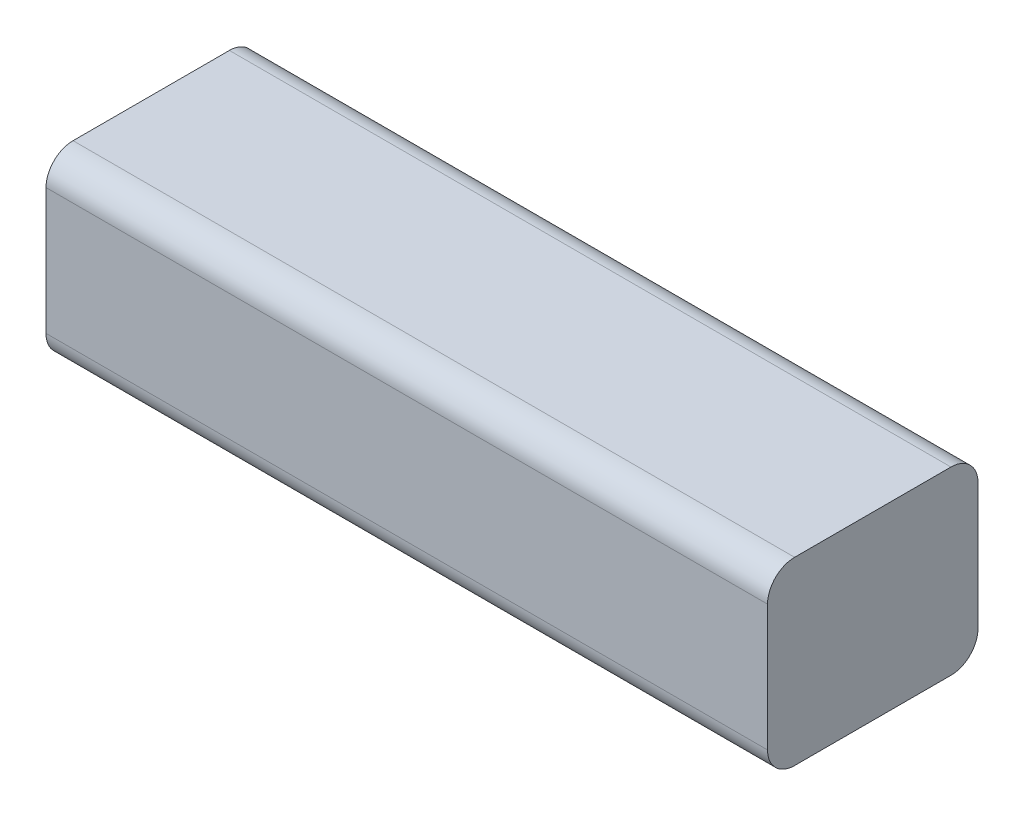
ISO-10303-21;
HEADER;
FILE_DESCRIPTION(('STEP AP214'),'2;1');
FILE_NAME('part.step','',(''),(''),'','','');
FILE_SCHEMA(('AUTOMOTIVE_DESIGN { 1 0 10303 214 1 1 1 1 }'));
ENDSEC;
DATA;
#1=APPLICATION_CONTEXT('core data for automotive mechanical design processes');
#2=APPLICATION_PROTOCOL_DEFINITION('international standard','automotive_design',2000,#1);
#3=PRODUCT_CONTEXT('',#1,'mechanical');
#4=PRODUCT('Part','Part','',(#3));
#5=PRODUCT_RELATED_PRODUCT_CATEGORY('part','',(#4));
#6=PRODUCT_DEFINITION_FORMATION('','',#4);
#7=PRODUCT_DEFINITION_CONTEXT('part definition',#1,'design');
#8=PRODUCT_DEFINITION('design','',#6,#7);
#9=PRODUCT_DEFINITION_SHAPE('','',#8);
#10=(LENGTH_UNIT() NAMED_UNIT(*) SI_UNIT(.MILLI.,.METRE.));
#11=(NAMED_UNIT(*) PLANE_ANGLE_UNIT() SI_UNIT($,.RADIAN.));
#12=(NAMED_UNIT(*) SI_UNIT($,.STERADIAN.) SOLID_ANGLE_UNIT());
#13=UNCERTAINTY_MEASURE_WITH_UNIT(LENGTH_MEASURE(1.E-05),#10,'distance_accuracy_value','');
#14=(GEOMETRIC_REPRESENTATION_CONTEXT(3) GLOBAL_UNCERTAINTY_ASSIGNED_CONTEXT((#13)) GLOBAL_UNIT_ASSIGNED_CONTEXT((#10,
#11,#12)) REPRESENTATION_CONTEXT('',''));
#15=CARTESIAN_POINT('',(0.,0.,0.));
#16=DIRECTION('',(0.,0.,1.));
#17=DIRECTION('',(1.,0.,0.));
#18=AXIS2_PLACEMENT_3D('',#15,#16,#17);
#19=CARTESIAN_POINT('',(120.,0.,35.));
#20=DIRECTION('',(0.,1.,0.));
#21=DIRECTION('',(-1.,0.,0.));
#22=AXIS2_PLACEMENT_3D('',#19,#20,#21);
#23=PLANE('',#22);
#24=DIRECTION('',(0.,0.,-1.));
#25=VECTOR('',#24,1.);
#26=CARTESIAN_POINT('',(120.,0.,35.));
#27=LINE('',#26,#25);
#28=CARTESIAN_POINT('',(120.,0.,30.5));
#29=VERTEX_POINT('',#28);
#30=CARTESIAN_POINT('',(120.,0.,4.5));
#31=VERTEX_POINT('',#30);
#32=EDGE_CURVE('E149',#29,#31,#27,.T.);
#33=ORIENTED_EDGE('',*,*,#32,.F.);
#34=DIRECTION('',(1.,0.,0.));
#35=VECTOR('',#34,1.);
#36=CARTESIAN_POINT('',(120.,0.,30.5));
#37=LINE('',#36,#35);
#38=CARTESIAN_POINT('',(0.,0.,30.5));
#39=VERTEX_POINT('',#38);
#40=EDGE_CURVE('E110',#29,#39,#37,.F.);
#41=ORIENTED_EDGE('',*,*,#40,.T.);
#42=DIRECTION('',(0.,0.,-1.));
#43=VECTOR('',#42,1.);
#44=CARTESIAN_POINT('',(0.,0.,35.));
#45=LINE('',#44,#43);
#46=CARTESIAN_POINT('',(0.,0.,4.5));
#47=VERTEX_POINT('',#46);
#48=EDGE_CURVE('E134',#39,#47,#45,.T.);
#49=ORIENTED_EDGE('',*,*,#48,.T.);
#50=DIRECTION('',(1.,0.,0.));
#51=VECTOR('',#50,1.);
#52=CARTESIAN_POINT('',(120.,0.,4.5));
#53=LINE('',#52,#51);
#54=EDGE_CURVE('E115',#47,#31,#53,.T.);
#55=ORIENTED_EDGE('',*,*,#54,.T.);
#56=EDGE_LOOP('',(#33,#41,#49,#55));
#57=FACE_BOUND('',#56,.T.);
#58=ADVANCED_FACE('F39',(#57),#23,.F.);
#59=CARTESIAN_POINT('',(120.,30.,35.));
#60=DIRECTION('',(-1.,0.,0.));
#61=DIRECTION('',(0.,0.,1.));
#62=AXIS2_PLACEMENT_3D('',#59,#60,#61);
#63=PLANE('',#62);
#64=DIRECTION('',(0.,1.,0.));
#65=VECTOR('',#64,1.);
#66=CARTESIAN_POINT('',(120.,30.,35.));
#67=LINE('',#66,#65);
#68=CARTESIAN_POINT('',(120.,4.5,35.));
#69=VERTEX_POINT('',#68);
#70=CARTESIAN_POINT('',(120.,25.5,35.));
#71=VERTEX_POINT('',#70);
#72=EDGE_CURVE('E123',#69,#71,#67,.T.);
#73=ORIENTED_EDGE('',*,*,#72,.F.);
#74=CARTESIAN_POINT('',(120.,4.5,30.5));
#75=DIRECTION('',(-1.,0.,0.));
#76=DIRECTION('',(0.,0.,1.));
#77=AXIS2_PLACEMENT_3D('',#74,#75,#76);
#78=CIRCLE('',#77,4.5);
#79=EDGE_CURVE('E105',#69,#29,#78,.F.);
#80=ORIENTED_EDGE('',*,*,#79,.T.);
#81=ORIENTED_EDGE('',*,*,#32,.T.);
#82=CARTESIAN_POINT('',(120.,4.5,4.5));
#83=DIRECTION('',(-1.,0.,0.));
#84=DIRECTION('',(0.,0.,1.));
#85=AXIS2_PLACEMENT_3D('',#82,#83,#84);
#86=CIRCLE('',#85,4.5);
#87=CARTESIAN_POINT('',(120.,4.5,0.));
#88=VERTEX_POINT('',#87);
#89=EDGE_CURVE('E116',#31,#88,#86,.F.);
#90=ORIENTED_EDGE('',*,*,#89,.T.);
#91=DIRECTION('',(0.,1.,0.));
#92=VECTOR('',#91,1.);
#93=CARTESIAN_POINT('',(120.,30.,0.));
#94=LINE('',#93,#92);
#95=CARTESIAN_POINT('',(120.,25.5,0.));
#96=VERTEX_POINT('',#95);
#97=EDGE_CURVE('E137',#88,#96,#94,.T.);
#98=ORIENTED_EDGE('',*,*,#97,.T.);
#99=CARTESIAN_POINT('',(120.,25.5,4.5));
#100=DIRECTION('',(-1.,0.,0.));
#101=DIRECTION('',(0.,0.,1.));
#102=AXIS2_PLACEMENT_3D('',#99,#100,#101);
#103=CIRCLE('',#102,4.5);
#104=CARTESIAN_POINT('',(120.,30.,4.5));
#105=VERTEX_POINT('',#104);
#106=EDGE_CURVE('E153',#96,#105,#103,.F.);
#107=ORIENTED_EDGE('',*,*,#106,.T.);
#108=DIRECTION('',(0.,0.,-1.));
#109=VECTOR('',#108,1.);
#110=CARTESIAN_POINT('',(120.,30.,35.));
#111=LINE('',#110,#109);
#112=CARTESIAN_POINT('',(120.,30.,30.5));
#113=VERTEX_POINT('',#112);
#114=EDGE_CURVE('E146',#113,#105,#111,.T.);
#115=ORIENTED_EDGE('',*,*,#114,.F.);
#116=CARTESIAN_POINT('',(120.,25.5,30.5));
#117=DIRECTION('',(-1.,0.,0.));
#118=DIRECTION('',(0.,0.,1.));
#119=AXIS2_PLACEMENT_3D('',#116,#117,#118);
#120=CIRCLE('',#119,4.5);
#121=EDGE_CURVE('E126',#113,#71,#120,.F.);
#122=ORIENTED_EDGE('',*,*,#121,.T.);
#123=EDGE_LOOP('',(#73,#80,#81,#90,#98,#107,#115,#122));
#124=FACE_BOUND('',#123,.T.);
#125=ADVANCED_FACE('F129',(#124),#63,.F.);
#126=CARTESIAN_POINT('',(0.,30.,35.));
#127=DIRECTION('',(0.,-1.,0.));
#128=DIRECTION('',(1.,0.,0.));
#129=AXIS2_PLACEMENT_3D('',#126,#127,#128);
#130=PLANE('',#129);
#131=ORIENTED_EDGE('',*,*,#114,.T.);
#132=DIRECTION('',(-1.,0.,0.));
#133=VECTOR('',#132,1.);
#134=CARTESIAN_POINT('',(0.,30.,4.5));
#135=LINE('',#134,#133);
#136=CARTESIAN_POINT('',(0.,30.,4.5));
#137=VERTEX_POINT('',#136);
#138=EDGE_CURVE('E11',#105,#137,#135,.T.);
#139=ORIENTED_EDGE('',*,*,#138,.T.);
#140=DIRECTION('',(0.,0.,-1.));
#141=VECTOR('',#140,1.);
#142=CARTESIAN_POINT('',(0.,30.,35.));
#143=LINE('',#142,#141);
#144=CARTESIAN_POINT('',(0.,30.,30.5));
#145=VERTEX_POINT('',#144);
#146=EDGE_CURVE('E144',#145,#137,#143,.T.);
#147=ORIENTED_EDGE('',*,*,#146,.F.);
#148=DIRECTION('',(-1.,0.,0.));
#149=VECTOR('',#148,1.);
#150=CARTESIAN_POINT('',(0.,30.,30.5));
#151=LINE('',#150,#149);
#152=EDGE_CURVE('E47',#145,#113,#151,.F.);
#153=ORIENTED_EDGE('',*,*,#152,.T.);
#154=EDGE_LOOP('',(#131,#139,#147,#153));
#155=FACE_BOUND('',#154,.T.);
#156=ADVANCED_FACE('F170',(#155),#130,.F.);
#157=CARTESIAN_POINT('',(0.,0.,35.));
#158=DIRECTION('',(1.,0.,0.));
#159=DIRECTION('',(0.,0.,-1.));
#160=AXIS2_PLACEMENT_3D('',#157,#158,#159);
#161=PLANE('',#160);
#162=ORIENTED_EDGE('',*,*,#48,.F.);
#163=CARTESIAN_POINT('',(0.,4.5,30.5));
#164=DIRECTION('',(1.,0.,0.));
#165=DIRECTION('',(0.,0.,-1.));
#166=AXIS2_PLACEMENT_3D('',#163,#164,#165);
#167=CIRCLE('',#166,4.5);
#168=CARTESIAN_POINT('',(0.,4.5,35.));
#169=VERTEX_POINT('',#168);
#170=EDGE_CURVE('E163',#39,#169,#167,.F.);
#171=ORIENTED_EDGE('',*,*,#170,.T.);
#172=DIRECTION('',(0.,-1.,0.));
#173=VECTOR('',#172,1.);
#174=CARTESIAN_POINT('',(0.,0.,35.));
#175=LINE('',#174,#173);
#176=CARTESIAN_POINT('',(0.,25.5,35.));
#177=VERTEX_POINT('',#176);
#178=EDGE_CURVE('E125',#177,#169,#175,.T.);
#179=ORIENTED_EDGE('',*,*,#178,.F.);
#180=CARTESIAN_POINT('',(0.,25.5,30.5));
#181=DIRECTION('',(1.,0.,0.));
#182=DIRECTION('',(0.,0.,-1.));
#183=AXIS2_PLACEMENT_3D('',#180,#181,#182);
#184=CIRCLE('',#183,4.5);
#185=EDGE_CURVE('E61',#177,#145,#184,.F.);
#186=ORIENTED_EDGE('',*,*,#185,.T.);
#187=ORIENTED_EDGE('',*,*,#146,.T.);
#188=CARTESIAN_POINT('',(0.,25.5,4.5));
#189=DIRECTION('',(1.,0.,0.));
#190=DIRECTION('',(0.,0.,-1.));
#191=AXIS2_PLACEMENT_3D('',#188,#189,#190);
#192=CIRCLE('',#191,4.5);
#193=CARTESIAN_POINT('',(0.,25.5,0.));
#194=VERTEX_POINT('',#193);
#195=EDGE_CURVE('E54',#137,#194,#192,.F.);
#196=ORIENTED_EDGE('',*,*,#195,.T.);
#197=DIRECTION('',(0.,-1.,0.));
#198=VECTOR('',#197,1.);
#199=CARTESIAN_POINT('',(0.,0.,0.));
#200=LINE('',#199,#198);
#201=CARTESIAN_POINT('',(0.,4.5,0.));
#202=VERTEX_POINT('',#201);
#203=EDGE_CURVE('E132',#194,#202,#200,.T.);
#204=ORIENTED_EDGE('',*,*,#203,.T.);
#205=CARTESIAN_POINT('',(0.,4.5,4.5));
#206=DIRECTION('',(1.,0.,0.));
#207=DIRECTION('',(0.,0.,-1.));
#208=AXIS2_PLACEMENT_3D('',#205,#206,#207);
#209=CIRCLE('',#208,4.5);
#210=EDGE_CURVE('E161',#202,#47,#209,.F.);
#211=ORIENTED_EDGE('',*,*,#210,.T.);
#212=EDGE_LOOP('',(#162,#171,#179,#186,#187,#196,#204,#211));
#213=FACE_BOUND('',#212,.T.);
#214=ADVANCED_FACE('F174',(#213),#161,.F.);
#215=CARTESIAN_POINT('',(0.,0.,35.));
#216=DIRECTION('',(0.,0.,-1.));
#217=DIRECTION('',(-1.,0.,0.));
#218=AXIS2_PLACEMENT_3D('',#215,#216,#217);
#219=PLANE('',#218);
#220=ORIENTED_EDGE('',*,*,#178,.T.);
#221=DIRECTION('',(1.,0.,0.));
#222=VECTOR('',#221,1.);
#223=CARTESIAN_POINT('',(0.,4.5,35.));
#224=LINE('',#223,#222);
#225=EDGE_CURVE('E109',#169,#69,#224,.T.);
#226=ORIENTED_EDGE('',*,*,#225,.T.);
#227=ORIENTED_EDGE('',*,*,#72,.T.);
#228=DIRECTION('',(-1.,0.,0.));
#229=VECTOR('',#228,1.);
#230=CARTESIAN_POINT('',(0.,25.5,35.));
#231=LINE('',#230,#229);
#232=EDGE_CURVE('E127',#71,#177,#231,.T.);
#233=ORIENTED_EDGE('',*,*,#232,.T.);
#234=EDGE_LOOP('',(#220,#226,#227,#233));
#235=FACE_BOUND('',#234,.T.);
#236=ADVANCED_FACE('F121',(#235),#219,.F.);
#237=CARTESIAN_POINT('',(0.,0.,0.));
#238=DIRECTION('',(0.,0.,-1.));
#239=DIRECTION('',(-1.,0.,0.));
#240=AXIS2_PLACEMENT_3D('',#237,#238,#239);
#241=PLANE('',#240);
#242=ORIENTED_EDGE('',*,*,#97,.F.);
#243=DIRECTION('',(1.,0.,0.));
#244=VECTOR('',#243,1.);
#245=CARTESIAN_POINT('',(0.,4.5,0.));
#246=LINE('',#245,#244);
#247=EDGE_CURVE('E167',#88,#202,#246,.F.);
#248=ORIENTED_EDGE('',*,*,#247,.T.);
#249=ORIENTED_EDGE('',*,*,#203,.F.);
#250=DIRECTION('',(-1.,0.,0.));
#251=VECTOR('',#250,1.);
#252=CARTESIAN_POINT('',(120.,25.5,0.));
#253=LINE('',#252,#251);
#254=EDGE_CURVE('E165',#194,#96,#253,.F.);
#255=ORIENTED_EDGE('',*,*,#254,.T.);
#256=EDGE_LOOP('',(#242,#248,#249,#255));
#257=FACE_BOUND('',#256,.T.);
#258=ADVANCED_FACE('F183',(#257),#241,.T.);
#259=CARTESIAN_POINT('',(0.,4.5,30.5));
#260=DIRECTION('',(1.,0.,0.));
#261=DIRECTION('',(0.,1.,0.));
#262=AXIS2_PLACEMENT_3D('',#259,#260,#261);
#263=CYLINDRICAL_SURFACE('',#262,4.5);
#264=ORIENTED_EDGE('',*,*,#170,.F.);
#265=ORIENTED_EDGE('',*,*,#40,.F.);
#266=ORIENTED_EDGE('',*,*,#79,.F.);
#267=ORIENTED_EDGE('',*,*,#225,.F.);
#268=EDGE_LOOP('',(#264,#265,#266,#267));
#269=FACE_BOUND('',#268,.T.);
#270=ADVANCED_FACE('F108',(#269),#263,.T.);
#271=CARTESIAN_POINT('',(120.,4.5,4.5));
#272=DIRECTION('',(-1.,0.,0.));
#273=DIRECTION('',(0.,-1.,0.));
#274=AXIS2_PLACEMENT_3D('',#271,#272,#273);
#275=CYLINDRICAL_SURFACE('',#274,4.5);
#276=ORIENTED_EDGE('',*,*,#210,.F.);
#277=ORIENTED_EDGE('',*,*,#247,.F.);
#278=ORIENTED_EDGE('',*,*,#89,.F.);
#279=ORIENTED_EDGE('',*,*,#54,.F.);
#280=EDGE_LOOP('',(#276,#277,#278,#279));
#281=FACE_BOUND('',#280,.T.);
#282=ADVANCED_FACE('F179',(#281),#275,.T.);
#283=CARTESIAN_POINT('',(0.,25.5,4.5));
#284=DIRECTION('',(1.,0.,0.));
#285=DIRECTION('',(0.,1.,0.));
#286=AXIS2_PLACEMENT_3D('',#283,#284,#285);
#287=CYLINDRICAL_SURFACE('',#286,4.5);
#288=ORIENTED_EDGE('',*,*,#106,.F.);
#289=ORIENTED_EDGE('',*,*,#254,.F.);
#290=ORIENTED_EDGE('',*,*,#195,.F.);
#291=ORIENTED_EDGE('',*,*,#138,.F.);
#292=EDGE_LOOP('',(#288,#289,#290,#291));
#293=FACE_BOUND('',#292,.T.);
#294=ADVANCED_FACE('F185',(#293),#287,.T.);
#295=CARTESIAN_POINT('',(0.,25.5,30.5));
#296=DIRECTION('',(-1.,0.,0.));
#297=DIRECTION('',(0.,-1.,0.));
#298=AXIS2_PLACEMENT_3D('',#295,#296,#297);
#299=CYLINDRICAL_SURFACE('',#298,4.5);
#300=ORIENTED_EDGE('',*,*,#121,.F.);
#301=ORIENTED_EDGE('',*,*,#152,.F.);
#302=ORIENTED_EDGE('',*,*,#185,.F.);
#303=ORIENTED_EDGE('',*,*,#232,.F.);
#304=EDGE_LOOP('',(#300,#301,#302,#303));
#305=FACE_BOUND('',#304,.T.);
#306=ADVANCED_FACE('F41',(#305),#299,.T.);
#307=CLOSED_SHELL('',(#58,#125,#156,#214,#236,#258,#270,#282,#294,#306));
#308=MANIFOLD_SOLID_BREP('B2',#307);
#309=ADVANCED_BREP_SHAPE_REPRESENTATION('',(#18,#308),#14);
#310=SHAPE_DEFINITION_REPRESENTATION(#9,#309);
ENDSEC;
END-ISO-10303-21;
